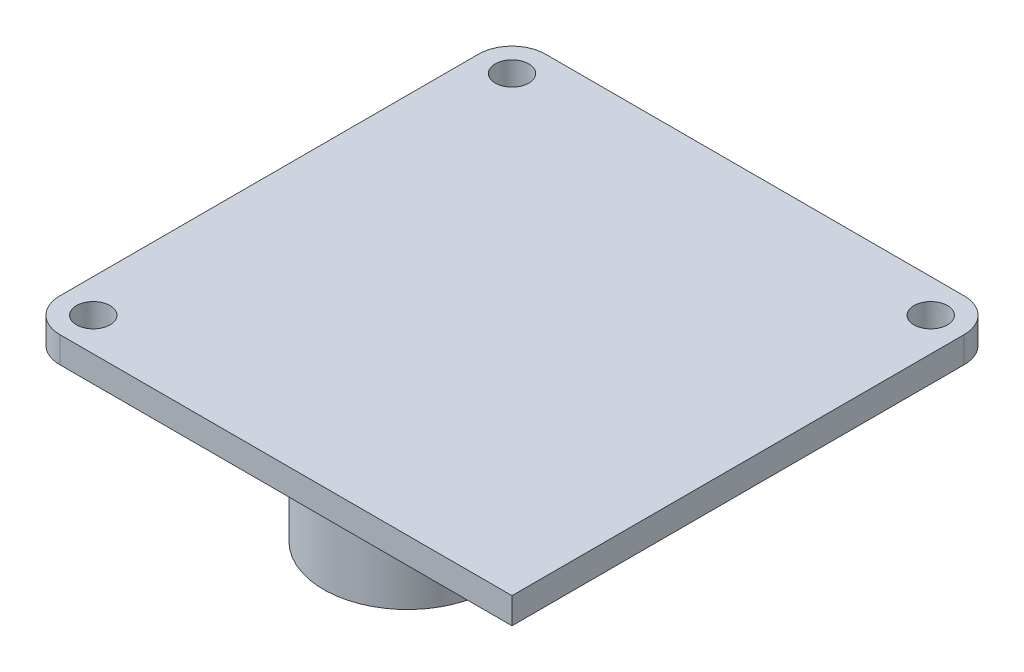
ISO-10303-21;
HEADER;
FILE_DESCRIPTION(('STEP AP214'),'2;1');
FILE_NAME('part.step','',(''),(''),'','','');
FILE_SCHEMA(('AUTOMOTIVE_DESIGN { 1 0 10303 214 1 1 1 1 }'));
ENDSEC;
DATA;
#1=APPLICATION_CONTEXT('core data for automotive mechanical design processes');
#2=APPLICATION_PROTOCOL_DEFINITION('international standard','automotive_design',2000,#1);
#3=PRODUCT_CONTEXT('',#1,'mechanical');
#4=PRODUCT('Part','Part','',(#3));
#5=PRODUCT_RELATED_PRODUCT_CATEGORY('part','',(#4));
#6=PRODUCT_DEFINITION_FORMATION('','',#4);
#7=PRODUCT_DEFINITION_CONTEXT('part definition',#1,'design');
#8=PRODUCT_DEFINITION('design','',#6,#7);
#9=PRODUCT_DEFINITION_SHAPE('','',#8);
#10=(LENGTH_UNIT() NAMED_UNIT(*) SI_UNIT(.MILLI.,.METRE.));
#11=(NAMED_UNIT(*) PLANE_ANGLE_UNIT() SI_UNIT($,.RADIAN.));
#12=(NAMED_UNIT(*) SI_UNIT($,.STERADIAN.) SOLID_ANGLE_UNIT());
#13=UNCERTAINTY_MEASURE_WITH_UNIT(LENGTH_MEASURE(1.E-05),#10,'distance_accuracy_value','');
#14=(GEOMETRIC_REPRESENTATION_CONTEXT(3) GLOBAL_UNCERTAINTY_ASSIGNED_CONTEXT((#13)) GLOBAL_UNIT_ASSIGNED_CONTEXT((#10,
#11,#12)) REPRESENTATION_CONTEXT('',''));
#15=CARTESIAN_POINT('',(0.,0.,0.));
#16=DIRECTION('',(0.,0.,1.));
#17=DIRECTION('',(1.,0.,0.));
#18=AXIS2_PLACEMENT_3D('',#15,#16,#17);
#19=CARTESIAN_POINT('',(0.,0.,0.));
#20=DIRECTION('',(0.,1.,0.));
#21=DIRECTION('',(1.,0.,0.));
#22=AXIS2_PLACEMENT_3D('',#19,#20,#21);
#23=PLANE('',#22);
#24=CARTESIAN_POINT('',(12.5,0.,-12.5));
#25=DIRECTION('',(0.,-1.,0.));
#26=DIRECTION('',(1.,0.,0.));
#27=AXIS2_PLACEMENT_3D('',#24,#25,#26);
#28=CIRCLE('',#27,1.);
#29=CARTESIAN_POINT('',(11.5,0.,-12.5));
#30=VERTEX_POINT('',#29);
#31=EDGE_CURVE('P0_E189',#30,#30,#28,.T.);
#32=ORIENTED_EDGE('',*,*,#31,.F.);
#33=EDGE_LOOP('',(#32));
#34=FACE_BOUND('',#33,.T.);
#35=CARTESIAN_POINT('',(-12.5,0.,12.5));
#36=DIRECTION('',(0.,-1.,0.));
#37=DIRECTION('',(1.,0.,0.));
#38=AXIS2_PLACEMENT_3D('',#35,#36,#37);
#39=CIRCLE('',#38,1.);
#40=CARTESIAN_POINT('',(-13.5,0.,12.5));
#41=VERTEX_POINT('',#40);
#42=EDGE_CURVE('P0_E237',#41,#41,#39,.T.);
#43=ORIENTED_EDGE('',*,*,#42,.F.);
#44=EDGE_LOOP('',(#43));
#45=FACE_BOUND('',#44,.T.);
#46=CARTESIAN_POINT('',(-12.5,0.,-12.5));
#47=DIRECTION('',(0.,-1.,0.));
#48=DIRECTION('',(1.,0.,0.));
#49=AXIS2_PLACEMENT_3D('',#46,#47,#48);
#50=CIRCLE('',#49,1.);
#51=CARTESIAN_POINT('',(-13.5,0.,-12.5));
#52=VERTEX_POINT('',#51);
#53=EDGE_CURVE('P0_E253',#52,#52,#50,.T.);
#54=ORIENTED_EDGE('',*,*,#53,.F.);
#55=EDGE_LOOP('',(#54));
#56=FACE_BOUND('',#55,.T.);
#57=DIRECTION('',(-1.,0.,0.));
#58=VECTOR('',#57,1.);
#59=CARTESIAN_POINT('',(-2.50000000000017,0.,-11.2500000000072));
#60=LINE('',#59,#58);
#61=CARTESIAN_POINT('',(4.99999999999967,0.,-11.2500000000072));
#62=VERTEX_POINT('',#61);
#63=CARTESIAN_POINT('',(-5.00000000000033,0.,-11.2500000000072));
#64=VERTEX_POINT('',#63);
#65=EDGE_CURVE('P0_E154',#62,#64,#60,.T.);
#66=ORIENTED_EDGE('',*,*,#65,.T.);
#67=DIRECTION('',(0.,0.,1.));
#68=VECTOR('',#67,1.);
#69=CARTESIAN_POINT('',(-5.00000000000033,0.,5.62499999999639));
#70=LINE('',#69,#68);
#71=CARTESIAN_POINT('',(-5.00000000000033,0.,11.2499999999928));
#72=VERTEX_POINT('',#71);
#73=EDGE_CURVE('P0_E203',#64,#72,#70,.T.);
#74=ORIENTED_EDGE('',*,*,#73,.T.);
#75=DIRECTION('',(1.,0.,0.));
#76=VECTOR('',#75,1.);
#77=CARTESIAN_POINT('',(2.49999999999984,0.,11.2499999999928));
#78=LINE('',#77,#76);
#79=CARTESIAN_POINT('',(4.99999999999967,0.,11.2499999999928));
#80=VERTEX_POINT('',#79);
#81=EDGE_CURVE('P0_E155',#72,#80,#78,.T.);
#82=ORIENTED_EDGE('',*,*,#81,.T.);
#83=DIRECTION('',(0.,0.,-1.));
#84=VECTOR('',#83,1.);
#85=CARTESIAN_POINT('',(4.99999999999967,0.,-5.62500000000361));
#86=LINE('',#85,#84);
#87=EDGE_CURVE('P0_E149',#80,#62,#86,.T.);
#88=ORIENTED_EDGE('',*,*,#87,.T.);
#89=EDGE_LOOP('',(#66,#74,#82,#88));
#90=FACE_BOUND('',#89,.T.);
#91=DIRECTION('',(0.,0.,1.));
#92=VECTOR('',#91,1.);
#93=CARTESIAN_POINT('',(14.5,0.,-12.5));
#94=LINE('',#93,#92);
#95=CARTESIAN_POINT('',(14.5,0.,-12.5));
#96=VERTEX_POINT('',#95);
#97=CARTESIAN_POINT('',(14.5,0.,14.5));
#98=VERTEX_POINT('',#97);
#99=EDGE_CURVE('P0_E25',#96,#98,#94,.T.);
#100=ORIENTED_EDGE('',*,*,#99,.T.);
#101=DIRECTION('',(-1.,0.,0.));
#102=VECTOR('',#101,1.);
#103=CARTESIAN_POINT('',(14.5,0.,14.5));
#104=LINE('',#103,#102);
#105=CARTESIAN_POINT('',(-12.5,0.,14.5));
#106=VERTEX_POINT('',#105);
#107=EDGE_CURVE('P0_E256',#98,#106,#104,.T.);
#108=ORIENTED_EDGE('',*,*,#107,.T.);
#109=CARTESIAN_POINT('',(-12.5,0.,12.5));
#110=DIRECTION('',(0.,1.,0.));
#111=DIRECTION('',(-1.,0.,0.));
#112=AXIS2_PLACEMENT_3D('',#109,#110,#111);
#113=CIRCLE('',#112,2.);
#114=CARTESIAN_POINT('',(-14.5,0.,12.5));
#115=VERTEX_POINT('',#114);
#116=EDGE_CURVE('P0_E272',#115,#106,#113,.T.);
#117=ORIENTED_EDGE('',*,*,#116,.F.);
#118=DIRECTION('',(0.,0.,-1.));
#119=VECTOR('',#118,1.);
#120=CARTESIAN_POINT('',(-14.5,0.,12.5));
#121=LINE('',#120,#119);
#122=CARTESIAN_POINT('',(-14.5,0.,-12.5));
#123=VERTEX_POINT('',#122);
#124=EDGE_CURVE('P0_E263',#115,#123,#121,.T.);
#125=ORIENTED_EDGE('',*,*,#124,.T.);
#126=CARTESIAN_POINT('',(-12.5,0.,-12.5));
#127=DIRECTION('',(0.,1.,0.));
#128=DIRECTION('',(0.,0.,-1.));
#129=AXIS2_PLACEMENT_3D('',#126,#127,#128);
#130=CIRCLE('',#129,2.);
#131=CARTESIAN_POINT('',(-12.5,0.,-14.5));
#132=VERTEX_POINT('',#131);
#133=EDGE_CURVE('P0_E200',#132,#123,#130,.T.);
#134=ORIENTED_EDGE('',*,*,#133,.F.);
#135=DIRECTION('',(1.,0.,0.));
#136=VECTOR('',#135,1.);
#137=CARTESIAN_POINT('',(-12.5,0.,-14.5));
#138=LINE('',#137,#136);
#139=CARTESIAN_POINT('',(12.5,0.,-14.5));
#140=VERTEX_POINT('',#139);
#141=EDGE_CURVE('P0_E241',#132,#140,#138,.T.);
#142=ORIENTED_EDGE('',*,*,#141,.T.);
#143=CARTESIAN_POINT('',(12.5,0.,-12.5));
#144=DIRECTION('',(0.,1.,0.));
#145=DIRECTION('',(1.,0.,0.));
#146=AXIS2_PLACEMENT_3D('',#143,#144,#145);
#147=CIRCLE('',#146,2.);
#148=EDGE_CURVE('P0_E210',#96,#140,#147,.T.);
#149=ORIENTED_EDGE('',*,*,#148,.F.);
#150=EDGE_LOOP('',(#100,#108,#117,#125,#134,#142,#149));
#151=FACE_BOUND('',#150,.T.);
#152=ADVANCED_FACE('P0_F17',(#34,#45,#56,#90,#151),#23,.F.);
#153=CARTESIAN_POINT('',(0.,1.56,0.));
#154=DIRECTION('',(0.,1.,0.));
#155=DIRECTION('',(1.,0.,0.));
#156=AXIS2_PLACEMENT_3D('',#153,#154,#155);
#157=PLANE('',#156);
#158=CARTESIAN_POINT('',(12.5,1.56,-12.5));
#159=DIRECTION('',(0.,-1.,0.));
#160=DIRECTION('',(1.,0.,0.));
#161=AXIS2_PLACEMENT_3D('',#158,#159,#160);
#162=CIRCLE('',#161,1.);
#163=CARTESIAN_POINT('',(11.5,1.56,-12.5));
#164=VERTEX_POINT('',#163);
#165=EDGE_CURVE('P0_E224',#164,#164,#162,.T.);
#166=ORIENTED_EDGE('',*,*,#165,.T.);
#167=EDGE_LOOP('',(#166));
#168=FACE_BOUND('',#167,.T.);
#169=CARTESIAN_POINT('',(-12.5,1.56,12.5));
#170=DIRECTION('',(0.,-1.,0.));
#171=DIRECTION('',(1.,0.,0.));
#172=AXIS2_PLACEMENT_3D('',#169,#170,#171);
#173=CIRCLE('',#172,1.);
#174=CARTESIAN_POINT('',(-13.5,1.56,12.5));
#175=VERTEX_POINT('',#174);
#176=EDGE_CURVE('P0_E185',#175,#175,#173,.T.);
#177=ORIENTED_EDGE('',*,*,#176,.T.);
#178=EDGE_LOOP('',(#177));
#179=FACE_BOUND('',#178,.T.);
#180=CARTESIAN_POINT('',(-12.5,1.56,-12.5));
#181=DIRECTION('',(0.,-1.,0.));
#182=DIRECTION('',(1.,0.,0.));
#183=AXIS2_PLACEMENT_3D('',#180,#181,#182);
#184=CIRCLE('',#183,1.);
#185=CARTESIAN_POINT('',(-13.5,1.56,-12.5));
#186=VERTEX_POINT('',#185);
#187=EDGE_CURVE('P0_E240',#186,#186,#184,.T.);
#188=ORIENTED_EDGE('',*,*,#187,.T.);
#189=EDGE_LOOP('',(#188));
#190=FACE_BOUND('',#189,.T.);
#191=DIRECTION('',(0.,0.,-1.));
#192=VECTOR('',#191,1.);
#193=CARTESIAN_POINT('',(14.5,1.56,-12.5));
#194=LINE('',#193,#192);
#195=CARTESIAN_POINT('',(14.5,1.56,14.5));
#196=VERTEX_POINT('',#195);
#197=CARTESIAN_POINT('',(14.5,1.56,-12.5));
#198=VERTEX_POINT('',#197);
#199=EDGE_CURVE('P0_E11',#196,#198,#194,.T.);
#200=ORIENTED_EDGE('',*,*,#199,.T.);
#201=CARTESIAN_POINT('',(12.5,1.56,-12.5));
#202=DIRECTION('',(0.,1.,0.));
#203=DIRECTION('',(1.,0.,0.));
#204=AXIS2_PLACEMENT_3D('',#201,#202,#203);
#205=CIRCLE('',#204,2.);
#206=CARTESIAN_POINT('',(12.5,1.56,-14.5));
#207=VERTEX_POINT('',#206);
#208=EDGE_CURVE('P0_E206',#198,#207,#205,.T.);
#209=ORIENTED_EDGE('',*,*,#208,.T.);
#210=DIRECTION('',(-1.,0.,0.));
#211=VECTOR('',#210,1.);
#212=CARTESIAN_POINT('',(-12.5,1.56,-14.5));
#213=LINE('',#212,#211);
#214=CARTESIAN_POINT('',(-12.5,1.56,-14.5));
#215=VERTEX_POINT('',#214);
#216=EDGE_CURVE('P0_E245',#207,#215,#213,.T.);
#217=ORIENTED_EDGE('',*,*,#216,.T.);
#218=CARTESIAN_POINT('',(-12.5,1.56,-12.5));
#219=DIRECTION('',(0.,1.,0.));
#220=DIRECTION('',(0.,0.,-1.));
#221=AXIS2_PLACEMENT_3D('',#218,#219,#220);
#222=CIRCLE('',#221,2.);
#223=CARTESIAN_POINT('',(-14.5,1.56,-12.5));
#224=VERTEX_POINT('',#223);
#225=EDGE_CURVE('P0_E196',#215,#224,#222,.T.);
#226=ORIENTED_EDGE('',*,*,#225,.T.);
#227=DIRECTION('',(0.,0.,1.));
#228=VECTOR('',#227,1.);
#229=CARTESIAN_POINT('',(-14.5,1.56,12.5));
#230=LINE('',#229,#228);
#231=CARTESIAN_POINT('',(-14.5,1.56,12.5));
#232=VERTEX_POINT('',#231);
#233=EDGE_CURVE('P0_E267',#224,#232,#230,.T.);
#234=ORIENTED_EDGE('',*,*,#233,.T.);
#235=CARTESIAN_POINT('',(-12.5,1.56,12.5));
#236=DIRECTION('',(0.,1.,0.));
#237=DIRECTION('',(-1.,0.,0.));
#238=AXIS2_PLACEMENT_3D('',#235,#236,#237);
#239=CIRCLE('',#238,2.);
#240=CARTESIAN_POINT('',(-12.5,1.56,14.5));
#241=VERTEX_POINT('',#240);
#242=EDGE_CURVE('P0_E275',#232,#241,#239,.T.);
#243=ORIENTED_EDGE('',*,*,#242,.T.);
#244=DIRECTION('',(1.,0.,0.));
#245=VECTOR('',#244,1.);
#246=CARTESIAN_POINT('',(14.5,1.56,14.5));
#247=LINE('',#246,#245);
#248=EDGE_CURVE('P0_E181',#241,#196,#247,.T.);
#249=ORIENTED_EDGE('',*,*,#248,.T.);
#250=EDGE_LOOP('',(#200,#209,#217,#226,#234,#243,#249));
#251=FACE_BOUND('',#250,.T.);
#252=ADVANCED_FACE('P0_F331',(#168,#179,#190,#251),#157,.T.);
#253=CARTESIAN_POINT('',(14.5,0.,14.5));
#254=DIRECTION('',(1.,0.,0.));
#255=DIRECTION('',(0.,0.,1.));
#256=AXIS2_PLACEMENT_3D('',#253,#254,#255);
#257=PLANE('',#256);
#258=ORIENTED_EDGE('',*,*,#99,.F.);
#259=DIRECTION('',(0.,1.,0.));
#260=VECTOR('',#259,1.);
#261=CARTESIAN_POINT('',(14.5,0.,-12.5));
#262=LINE('',#261,#260);
#263=EDGE_CURVE('P0_E209',#96,#198,#262,.T.);
#264=ORIENTED_EDGE('',*,*,#263,.T.);
#265=ORIENTED_EDGE('',*,*,#199,.F.);
#266=DIRECTION('',(0.,1.,0.));
#267=VECTOR('',#266,1.);
#268=CARTESIAN_POINT('',(14.5,0.,14.5));
#269=LINE('',#268,#267);
#270=EDGE_CURVE('P0_E184',#98,#196,#269,.T.);
#271=ORIENTED_EDGE('',*,*,#270,.F.);
#272=EDGE_LOOP('',(#258,#264,#265,#271));
#273=FACE_BOUND('',#272,.T.);
#274=ADVANCED_FACE('P0_F306',(#273),#257,.T.);
#275=CARTESIAN_POINT('',(12.5,0.,-12.5));
#276=DIRECTION('',(0.,1.,0.));
#277=DIRECTION('',(1.,0.,0.));
#278=AXIS2_PLACEMENT_3D('',#275,#276,#277);
#279=CYLINDRICAL_SURFACE('',#278,2.);
#280=ORIENTED_EDGE('',*,*,#148,.T.);
#281=DIRECTION('',(0.,1.,0.));
#282=VECTOR('',#281,1.);
#283=CARTESIAN_POINT('',(12.5,0.,-14.5));
#284=LINE('',#283,#282);
#285=EDGE_CURVE('P0_E289',#140,#207,#284,.T.);
#286=ORIENTED_EDGE('',*,*,#285,.T.);
#287=ORIENTED_EDGE('',*,*,#208,.F.);
#288=ORIENTED_EDGE('',*,*,#263,.F.);
#289=EDGE_LOOP('',(#280,#286,#287,#288));
#290=FACE_BOUND('',#289,.T.);
#291=ADVANCED_FACE('P0_F330',(#290),#279,.T.);
#292=CARTESIAN_POINT('',(12.5,0.,-14.5));
#293=DIRECTION('',(0.,0.,-1.));
#294=DIRECTION('',(0.,-1.,0.));
#295=AXIS2_PLACEMENT_3D('',#292,#293,#294);
#296=PLANE('',#295);
#297=ORIENTED_EDGE('',*,*,#141,.F.);
#298=DIRECTION('',(0.,1.,0.));
#299=VECTOR('',#298,1.);
#300=CARTESIAN_POINT('',(-12.5,0.,-14.5));
#301=LINE('',#300,#299);
#302=EDGE_CURVE('P0_E199',#132,#215,#301,.T.);
#303=ORIENTED_EDGE('',*,*,#302,.T.);
#304=ORIENTED_EDGE('',*,*,#216,.F.);
#305=ORIENTED_EDGE('',*,*,#285,.F.);
#306=EDGE_LOOP('',(#297,#303,#304,#305));
#307=FACE_BOUND('',#306,.T.);
#308=ADVANCED_FACE('P0_F326',(#307),#296,.T.);
#309=CARTESIAN_POINT('',(-12.5,0.,-12.5));
#310=DIRECTION('',(0.,1.,0.));
#311=DIRECTION('',(0.,0.,-1.));
#312=AXIS2_PLACEMENT_3D('',#309,#310,#311);
#313=CYLINDRICAL_SURFACE('',#312,2.);
#314=ORIENTED_EDGE('',*,*,#133,.T.);
#315=DIRECTION('',(0.,1.,0.));
#316=VECTOR('',#315,1.);
#317=CARTESIAN_POINT('',(-14.5,0.,-12.5));
#318=LINE('',#317,#316);
#319=EDGE_CURVE('P0_E286',#123,#224,#318,.T.);
#320=ORIENTED_EDGE('',*,*,#319,.T.);
#321=ORIENTED_EDGE('',*,*,#225,.F.);
#322=ORIENTED_EDGE('',*,*,#302,.F.);
#323=EDGE_LOOP('',(#314,#320,#321,#322));
#324=FACE_BOUND('',#323,.T.);
#325=ADVANCED_FACE('P0_F322',(#324),#313,.T.);
#326=CARTESIAN_POINT('',(-14.5,0.,-12.5));
#327=DIRECTION('',(-1.,0.,0.));
#328=DIRECTION('',(0.,0.,1.));
#329=AXIS2_PLACEMENT_3D('',#326,#327,#328);
#330=PLANE('',#329);
#331=ORIENTED_EDGE('',*,*,#124,.F.);
#332=DIRECTION('',(0.,1.,0.));
#333=VECTOR('',#332,1.);
#334=CARTESIAN_POINT('',(-14.5,0.,12.5));
#335=LINE('',#334,#333);
#336=EDGE_CURVE('P0_E268',#115,#232,#335,.T.);
#337=ORIENTED_EDGE('',*,*,#336,.T.);
#338=ORIENTED_EDGE('',*,*,#233,.F.);
#339=ORIENTED_EDGE('',*,*,#319,.F.);
#340=EDGE_LOOP('',(#331,#337,#338,#339));
#341=FACE_BOUND('',#340,.T.);
#342=ADVANCED_FACE('P0_F318',(#341),#330,.T.);
#343=CARTESIAN_POINT('',(-12.5,0.,12.5));
#344=DIRECTION('',(0.,1.,0.));
#345=DIRECTION('',(-1.,0.,0.));
#346=AXIS2_PLACEMENT_3D('',#343,#344,#345);
#347=CYLINDRICAL_SURFACE('',#346,2.);
#348=ORIENTED_EDGE('',*,*,#116,.T.);
#349=DIRECTION('',(0.,1.,0.));
#350=VECTOR('',#349,1.);
#351=CARTESIAN_POINT('',(-12.5,0.,14.5));
#352=LINE('',#351,#350);
#353=EDGE_CURVE('P0_E183',#106,#241,#352,.T.);
#354=ORIENTED_EDGE('',*,*,#353,.T.);
#355=ORIENTED_EDGE('',*,*,#242,.F.);
#356=ORIENTED_EDGE('',*,*,#336,.F.);
#357=EDGE_LOOP('',(#348,#354,#355,#356));
#358=FACE_BOUND('',#357,.T.);
#359=ADVANCED_FACE('P0_F313',(#358),#347,.T.);
#360=CARTESIAN_POINT('',(-12.5,0.,14.5));
#361=DIRECTION('',(0.,0.,1.));
#362=DIRECTION('',(1.,0.,0.));
#363=AXIS2_PLACEMENT_3D('',#360,#361,#362);
#364=PLANE('',#363);
#365=ORIENTED_EDGE('',*,*,#107,.F.);
#366=ORIENTED_EDGE('',*,*,#270,.T.);
#367=ORIENTED_EDGE('',*,*,#248,.F.);
#368=ORIENTED_EDGE('',*,*,#353,.F.);
#369=EDGE_LOOP('',(#365,#366,#367,#368));
#370=FACE_BOUND('',#369,.T.);
#371=ADVANCED_FACE('P0_F310',(#370),#364,.T.);
#372=CARTESIAN_POINT('',(-12.5,0.,-12.5));
#373=DIRECTION('',(0.,1.,0.));
#374=DIRECTION('',(1.,0.,0.));
#375=AXIS2_PLACEMENT_3D('',#372,#373,#374);
#376=CYLINDRICAL_SURFACE('',#375,1.);
#377=ORIENTED_EDGE('',*,*,#187,.F.);
#378=DIRECTION('',(0.,-1.,0.));
#379=VECTOR('',#378,1.);
#380=CARTESIAN_POINT('',(-13.5,0.,-12.5));
#381=LINE('',#380,#379);
#382=EDGE_CURVE('P0_E249',#186,#52,#381,.T.);
#383=ORIENTED_EDGE('',*,*,#382,.T.);
#384=ORIENTED_EDGE('',*,*,#53,.T.);
#385=ORIENTED_EDGE('',*,*,#382,.F.);
#386=EDGE_LOOP('',(#377,#383,#384,#385));
#387=FACE_BOUND('',#386,.T.);
#388=ADVANCED_FACE('P0_F349',(#387),#376,.F.);
#389=CARTESIAN_POINT('',(-12.5,0.,12.5));
#390=DIRECTION('',(0.,1.,0.));
#391=DIRECTION('',(1.,0.,0.));
#392=AXIS2_PLACEMENT_3D('',#389,#390,#391);
#393=CYLINDRICAL_SURFACE('',#392,1.);
#394=ORIENTED_EDGE('',*,*,#176,.F.);
#395=DIRECTION('',(0.,-1.,0.));
#396=VECTOR('',#395,1.);
#397=CARTESIAN_POINT('',(-13.5,0.,12.5));
#398=LINE('',#397,#396);
#399=EDGE_CURVE('P0_E188',#175,#41,#398,.T.);
#400=ORIENTED_EDGE('',*,*,#399,.T.);
#401=ORIENTED_EDGE('',*,*,#42,.T.);
#402=ORIENTED_EDGE('',*,*,#399,.F.);
#403=EDGE_LOOP('',(#394,#400,#401,#402));
#404=FACE_BOUND('',#403,.T.);
#405=ADVANCED_FACE('P0_F346',(#404),#393,.F.);
#406=CARTESIAN_POINT('',(12.5,0.,-12.5));
#407=DIRECTION('',(0.,1.,0.));
#408=DIRECTION('',(1.,0.,0.));
#409=AXIS2_PLACEMENT_3D('',#406,#407,#408);
#410=CYLINDRICAL_SURFACE('',#409,1.);
#411=ORIENTED_EDGE('',*,*,#165,.F.);
#412=DIRECTION('',(0.,-1.,0.));
#413=VECTOR('',#412,1.);
#414=CARTESIAN_POINT('',(11.5,0.,-12.5));
#415=LINE('',#414,#413);
#416=EDGE_CURVE('P0_E228',#164,#30,#415,.T.);
#417=ORIENTED_EDGE('',*,*,#416,.T.);
#418=ORIENTED_EDGE('',*,*,#31,.T.);
#419=ORIENTED_EDGE('',*,*,#416,.F.);
#420=EDGE_LOOP('',(#411,#417,#418,#419));
#421=FACE_BOUND('',#420,.T.);
#422=ADVANCED_FACE('P0_F345',(#421),#410,.F.);
#423=CARTESIAN_POINT('',(-3.31956684362922E-13,-2.,-7.21422921401427E-12));
#424=DIRECTION('',(0.,-1.,0.));
#425=DIRECTION('',(0.,0.,-1.));
#426=AXIS2_PLACEMENT_3D('',#423,#424,#425);
#427=PLANE('',#426);
#428=DIRECTION('',(0.,0.,1.));
#429=VECTOR('',#428,1.);
#430=CARTESIAN_POINT('',(4.99999999999967,-2.,-11.2500000000072));
#431=LINE('',#430,#429);
#432=CARTESIAN_POINT('',(4.99999999999967,-2.,-11.2500000000072));
#433=VERTEX_POINT('',#432);
#434=CARTESIAN_POINT('',(4.99999999999967,-2.,11.2499999999928));
#435=VERTEX_POINT('',#434);
#436=EDGE_CURVE('P0_E160',#433,#435,#431,.T.);
#437=ORIENTED_EDGE('',*,*,#436,.T.);
#438=DIRECTION('',(-1.,0.,0.));
#439=VECTOR('',#438,1.);
#440=CARTESIAN_POINT('',(4.99999999999967,-2.,11.2499999999928));
#441=LINE('',#440,#439);
#442=CARTESIAN_POINT('',(-5.00000000000033,-2.,11.2499999999928));
#443=VERTEX_POINT('',#442);
#444=EDGE_CURVE('P0_E217',#435,#443,#441,.T.);
#445=ORIENTED_EDGE('',*,*,#444,.T.);
#446=DIRECTION('',(0.,0.,-1.));
#447=VECTOR('',#446,1.);
#448=CARTESIAN_POINT('',(-5.00000000000033,-2.,11.2499999999928));
#449=LINE('',#448,#447);
#450=CARTESIAN_POINT('',(-5.00000000000033,-2.,-11.2500000000072));
#451=VERTEX_POINT('',#450);
#452=EDGE_CURVE('P0_E195',#443,#451,#449,.T.);
#453=ORIENTED_EDGE('',*,*,#452,.T.);
#454=DIRECTION('',(1.,0.,0.));
#455=VECTOR('',#454,1.);
#456=CARTESIAN_POINT('',(-5.00000000000033,-2.,-11.2500000000072));
#457=LINE('',#456,#455);
#458=EDGE_CURVE('P0_E170',#451,#433,#457,.T.);
#459=ORIENTED_EDGE('',*,*,#458,.T.);
#460=EDGE_LOOP('',(#437,#445,#453,#459));
#461=FACE_BOUND('',#460,.T.);
#462=ADVANCED_FACE('P0_F413',(#461),#427,.T.);
#463=CARTESIAN_POINT('',(4.99999999999967,0.,-11.2500000000072));
#464=DIRECTION('',(1.,0.,0.));
#465=DIRECTION('',(0.,1.,0.));
#466=AXIS2_PLACEMENT_3D('',#463,#464,#465);
#467=PLANE('',#466);
#468=ORIENTED_EDGE('',*,*,#87,.F.);
#469=DIRECTION('',(0.,-1.,0.));
#470=VECTOR('',#469,1.);
#471=CARTESIAN_POINT('',(4.99999999999967,0.,11.2499999999928));
#472=LINE('',#471,#470);
#473=EDGE_CURVE('P0_E161',#80,#435,#472,.T.);
#474=ORIENTED_EDGE('',*,*,#473,.T.);
#475=ORIENTED_EDGE('',*,*,#436,.F.);
#476=DIRECTION('',(0.,-1.,0.));
#477=VECTOR('',#476,1.);
#478=CARTESIAN_POINT('',(4.99999999999967,0.,-11.2500000000072));
#479=LINE('',#478,#477);
#480=EDGE_CURVE('P0_E164',#62,#433,#479,.T.);
#481=ORIENTED_EDGE('',*,*,#480,.F.);
#482=EDGE_LOOP('',(#468,#474,#475,#481));
#483=FACE_BOUND('',#482,.T.);
#484=ADVANCED_FACE('P0_F165',(#483),#467,.T.);
#485=CARTESIAN_POINT('',(4.99999999999967,0.,11.2499999999928));
#486=DIRECTION('',(0.,0.,1.));
#487=DIRECTION('',(1.,0.,0.));
#488=AXIS2_PLACEMENT_3D('',#485,#486,#487);
#489=PLANE('',#488);
#490=ORIENTED_EDGE('',*,*,#81,.F.);
#491=DIRECTION('',(0.,-1.,0.));
#492=VECTOR('',#491,1.);
#493=CARTESIAN_POINT('',(-5.00000000000033,0.,11.2499999999928));
#494=LINE('',#493,#492);
#495=EDGE_CURVE('P0_E191',#72,#443,#494,.T.);
#496=ORIENTED_EDGE('',*,*,#495,.T.);
#497=ORIENTED_EDGE('',*,*,#444,.F.);
#498=ORIENTED_EDGE('',*,*,#473,.F.);
#499=EDGE_LOOP('',(#490,#496,#497,#498));
#500=FACE_BOUND('',#499,.T.);
#501=ADVANCED_FACE('P0_F429',(#500),#489,.T.);
#502=CARTESIAN_POINT('',(-5.00000000000033,0.,11.2499999999928));
#503=DIRECTION('',(-1.,0.,0.));
#504=DIRECTION('',(0.,1.,0.));
#505=AXIS2_PLACEMENT_3D('',#502,#503,#504);
#506=PLANE('',#505);
#507=ORIENTED_EDGE('',*,*,#73,.F.);
#508=DIRECTION('',(0.,-1.,0.));
#509=VECTOR('',#508,1.);
#510=CARTESIAN_POINT('',(-5.00000000000033,0.,-11.2500000000072));
#511=LINE('',#510,#509);
#512=EDGE_CURVE('P0_E175',#64,#451,#511,.T.);
#513=ORIENTED_EDGE('',*,*,#512,.T.);
#514=ORIENTED_EDGE('',*,*,#452,.F.);
#515=ORIENTED_EDGE('',*,*,#495,.F.);
#516=EDGE_LOOP('',(#507,#513,#514,#515));
#517=FACE_BOUND('',#516,.T.);
#518=ADVANCED_FACE('P0_F437',(#517),#506,.T.);
#519=CARTESIAN_POINT('',(-5.00000000000033,0.,-11.2500000000072));
#520=DIRECTION('',(0.,0.,-1.));
#521=DIRECTION('',(-1.,0.,0.));
#522=AXIS2_PLACEMENT_3D('',#519,#520,#521);
#523=PLANE('',#522);
#524=ORIENTED_EDGE('',*,*,#65,.F.);
#525=ORIENTED_EDGE('',*,*,#480,.T.);
#526=ORIENTED_EDGE('',*,*,#458,.F.);
#527=ORIENTED_EDGE('',*,*,#512,.F.);
#528=EDGE_LOOP('',(#524,#525,#526,#527));
#529=FACE_BOUND('',#528,.T.);
#530=ADVANCED_FACE('P0_F173',(#529),#523,.T.);
#531=CLOSED_SHELL('',(#152,#252,#274,#291,#308,#325,#342,#359,#371,#388,#405,#422,#462,#484,
#501,#518,#530));
#532=MANIFOLD_SOLID_BREP('P0_B1',#531);
#533=CARTESIAN_POINT('',(-3.31401572850609E-13,-2.,6.24999999999279));
#534=DIRECTION('',(0.,-1.,0.));
#535=DIRECTION('',(0.,0.,-1.));
#536=AXIS2_PLACEMENT_3D('',#533,#534,#535);
#537=PLANE('',#536);
#538=DIRECTION('',(-1.,0.,0.));
#539=VECTOR('',#538,1.);
#540=CARTESIAN_POINT('',(4.99999999999967,-2.,1.24999999999279));
#541=LINE('',#540,#539);
#542=CARTESIAN_POINT('',(4.99999999999967,-2.,1.24999999999279));
#543=VERTEX_POINT('',#542);
#544=CARTESIAN_POINT('',(-5.00000000000033,-2.,1.24999999999279));
#545=VERTEX_POINT('',#544);
#546=EDGE_CURVE('P1_E11',#543,#545,#541,.T.);
#547=ORIENTED_EDGE('',*,*,#546,.T.);
#548=DIRECTION('',(0.,0.,1.));
#549=VECTOR('',#548,1.);
#550=CARTESIAN_POINT('',(-5.00000000000033,-2.,1.24999999999279));
#551=LINE('',#550,#549);
#552=CARTESIAN_POINT('',(-5.00000000000033,-2.,11.2499999999928));
#553=VERTEX_POINT('',#552);
#554=EDGE_CURVE('P1_E68',#545,#553,#551,.T.);
#555=ORIENTED_EDGE('',*,*,#554,.T.);
#556=DIRECTION('',(1.,0.,0.));
#557=VECTOR('',#556,1.);
#558=CARTESIAN_POINT('',(-5.00000000000033,-2.,11.2499999999928));
#559=LINE('',#558,#557);
#560=CARTESIAN_POINT('',(4.99999999999967,-2.,11.2499999999928));
#561=VERTEX_POINT('',#560);
#562=EDGE_CURVE('P1_E95',#553,#561,#559,.T.);
#563=ORIENTED_EDGE('',*,*,#562,.T.);
#564=DIRECTION('',(0.,0.,-1.));
#565=VECTOR('',#564,1.);
#566=CARTESIAN_POINT('',(4.99999999999967,-2.,11.2499999999928));
#567=LINE('',#566,#565);
#568=EDGE_CURVE('P1_E48',#561,#543,#567,.T.);
#569=ORIENTED_EDGE('',*,*,#568,.T.);
#570=EDGE_LOOP('',(#547,#555,#563,#569));
#571=FACE_BOUND('',#570,.T.);
#572=ADVANCED_FACE('P1_F17',(#571),#537,.F.);
#573=CARTESIAN_POINT('',(-5.00000000000033,-2.,1.24999999999279));
#574=DIRECTION('',(0.,0.,-1.));
#575=DIRECTION('',(0.,-1.,0.));
#576=AXIS2_PLACEMENT_3D('',#573,#574,#575);
#577=PLANE('',#576);
#578=ORIENTED_EDGE('',*,*,#546,.F.);
#579=DIRECTION('',(0.,-1.,0.));
#580=VECTOR('',#579,1.);
#581=CARTESIAN_POINT('',(4.99999999999967,-2.,1.24999999999279));
#582=LINE('',#581,#580);
#583=CARTESIAN_POINT('',(4.99999999999967,-3.,1.24999999999279));
#584=VERTEX_POINT('',#583);
#585=EDGE_CURVE('P1_E26',#543,#584,#582,.T.);
#586=ORIENTED_EDGE('',*,*,#585,.T.);
#587=DIRECTION('',(1.,0.,0.));
#588=VECTOR('',#587,1.);
#589=CARTESIAN_POINT('',(4.99999999999967,-3.,1.24999999999279));
#590=LINE('',#589,#588);
#591=CARTESIAN_POINT('',(-3.31401572850609E-13,-3.,1.24999999999279));
#592=VERTEX_POINT('',#591);
#593=EDGE_CURVE('P1_E107',#592,#584,#590,.T.);
#594=ORIENTED_EDGE('',*,*,#593,.F.);
#595=DIRECTION('',(1.,0.,0.));
#596=VECTOR('',#595,1.);
#597=CARTESIAN_POINT('',(4.99999999999967,-3.,1.24999999999279));
#598=LINE('',#597,#596);
#599=CARTESIAN_POINT('',(-5.00000000000033,-3.,1.24999999999279));
#600=VERTEX_POINT('',#599);
#601=EDGE_CURVE('P1_E74',#600,#592,#598,.T.);
#602=ORIENTED_EDGE('',*,*,#601,.F.);
#603=DIRECTION('',(0.,-1.,0.));
#604=VECTOR('',#603,1.);
#605=CARTESIAN_POINT('',(-5.00000000000033,-2.,1.24999999999279));
#606=LINE('',#605,#604);
#607=EDGE_CURVE('P1_E70',#545,#600,#606,.T.);
#608=ORIENTED_EDGE('',*,*,#607,.F.);
#609=EDGE_LOOP('',(#578,#586,#594,#602,#608));
#610=FACE_BOUND('',#609,.T.);
#611=ADVANCED_FACE('P1_F71',(#610),#577,.T.);
#612=CARTESIAN_POINT('',(4.99999999999967,-2.,1.24999999999279));
#613=DIRECTION('',(1.,0.,0.));
#614=DIRECTION('',(0.,1.,0.));
#615=AXIS2_PLACEMENT_3D('',#612,#613,#614);
#616=PLANE('',#615);
#617=ORIENTED_EDGE('',*,*,#568,.F.);
#618=DIRECTION('',(0.,-1.,0.));
#619=VECTOR('',#618,1.);
#620=CARTESIAN_POINT('',(4.99999999999967,-2.,11.2499999999928));
#621=LINE('',#620,#619);
#622=CARTESIAN_POINT('',(4.99999999999967,-3.,11.2499999999928));
#623=VERTEX_POINT('',#622);
#624=EDGE_CURVE('P1_E98',#561,#623,#621,.T.);
#625=ORIENTED_EDGE('',*,*,#624,.T.);
#626=DIRECTION('',(0.,0.,1.));
#627=VECTOR('',#626,1.);
#628=CARTESIAN_POINT('',(4.99999999999967,-3.,11.2499999999928));
#629=LINE('',#628,#627);
#630=CARTESIAN_POINT('',(4.99999999999967,-3.,6.24999999999279));
#631=VERTEX_POINT('',#630);
#632=EDGE_CURVE('P1_E114',#631,#623,#629,.T.);
#633=ORIENTED_EDGE('',*,*,#632,.F.);
#634=DIRECTION('',(0.,0.,1.));
#635=VECTOR('',#634,1.);
#636=CARTESIAN_POINT('',(4.99999999999967,-3.,11.2499999999928));
#637=LINE('',#636,#635);
#638=EDGE_CURVE('P1_E111',#584,#631,#637,.T.);
#639=ORIENTED_EDGE('',*,*,#638,.F.);
#640=ORIENTED_EDGE('',*,*,#585,.F.);
#641=EDGE_LOOP('',(#617,#625,#633,#639,#640));
#642=FACE_BOUND('',#641,.T.);
#643=ADVANCED_FACE('P1_F19',(#642),#616,.T.);
#644=CARTESIAN_POINT('',(4.99999999999967,-2.,11.2499999999928));
#645=DIRECTION('',(0.,0.,1.));
#646=DIRECTION('',(1.,0.,0.));
#647=AXIS2_PLACEMENT_3D('',#644,#645,#646);
#648=PLANE('',#647);
#649=ORIENTED_EDGE('',*,*,#562,.F.);
#650=DIRECTION('',(0.,-1.,0.));
#651=VECTOR('',#650,1.);
#652=CARTESIAN_POINT('',(-5.00000000000033,-2.,11.2499999999928));
#653=LINE('',#652,#651);
#654=CARTESIAN_POINT('',(-5.00000000000033,-3.,11.2499999999928));
#655=VERTEX_POINT('',#654);
#656=EDGE_CURVE('P1_E79',#553,#655,#653,.T.);
#657=ORIENTED_EDGE('',*,*,#656,.T.);
#658=DIRECTION('',(-1.,0.,0.));
#659=VECTOR('',#658,1.);
#660=CARTESIAN_POINT('',(-5.00000000000033,-3.,11.2499999999928));
#661=LINE('',#660,#659);
#662=CARTESIAN_POINT('',(-3.31401572850609E-13,-3.,11.2499999999928));
#663=VERTEX_POINT('',#662);
#664=EDGE_CURVE('P1_E164',#663,#655,#661,.T.);
#665=ORIENTED_EDGE('',*,*,#664,.F.);
#666=DIRECTION('',(-1.,0.,0.));
#667=VECTOR('',#666,1.);
#668=CARTESIAN_POINT('',(-5.00000000000033,-3.,11.2499999999928));
#669=LINE('',#668,#667);
#670=EDGE_CURVE('P1_E124',#623,#663,#669,.T.);
#671=ORIENTED_EDGE('',*,*,#670,.F.);
#672=ORIENTED_EDGE('',*,*,#624,.F.);
#673=EDGE_LOOP('',(#649,#657,#665,#671,#672));
#674=FACE_BOUND('',#673,.T.);
#675=ADVANCED_FACE('P1_F241',(#674),#648,.T.);
#676=CARTESIAN_POINT('',(-5.00000000000033,-2.,11.2499999999928));
#677=DIRECTION('',(-1.,0.,0.));
#678=DIRECTION('',(0.,0.,1.));
#679=AXIS2_PLACEMENT_3D('',#676,#677,#678);
#680=PLANE('',#679);
#681=ORIENTED_EDGE('',*,*,#554,.F.);
#682=ORIENTED_EDGE('',*,*,#607,.T.);
#683=DIRECTION('',(0.,0.,-1.));
#684=VECTOR('',#683,1.);
#685=CARTESIAN_POINT('',(-5.00000000000033,-3.,1.24999999999279));
#686=LINE('',#685,#684);
#687=CARTESIAN_POINT('',(-5.00000000000033,-3.,6.24999999999278));
#688=VERTEX_POINT('',#687);
#689=EDGE_CURVE('P1_E89',#688,#600,#686,.T.);
#690=ORIENTED_EDGE('',*,*,#689,.F.);
#691=DIRECTION('',(0.,0.,-1.));
#692=VECTOR('',#691,1.);
#693=CARTESIAN_POINT('',(-5.00000000000033,-3.,1.24999999999279));
#694=LINE('',#693,#692);
#695=EDGE_CURVE('P1_E160',#655,#688,#694,.T.);
#696=ORIENTED_EDGE('',*,*,#695,.F.);
#697=ORIENTED_EDGE('',*,*,#656,.F.);
#698=EDGE_LOOP('',(#681,#682,#690,#696,#697));
#699=FACE_BOUND('',#698,.T.);
#700=ADVANCED_FACE('P1_F82',(#699),#680,.T.);
#701=CARTESIAN_POINT('',(-3.31401572850609E-13,-3.,6.24999999999279));
#702=DIRECTION('',(0.,-1.,0.));
#703=DIRECTION('',(0.,0.,-1.));
#704=AXIS2_PLACEMENT_3D('',#701,#702,#703);
#705=PLANE('',#704);
#706=CARTESIAN_POINT('',(-3.31401572850609E-13,-3.,6.24999999999279));
#707=DIRECTION('',(0.,1.,0.));
#708=DIRECTION('',(1.,0.,0.));
#709=AXIS2_PLACEMENT_3D('',#706,#707,#708);
#710=CIRCLE('',#709,5.);
#711=EDGE_CURVE('P1_E144',#592,#688,#710,.T.);
#712=ORIENTED_EDGE('',*,*,#711,.T.);
#713=ORIENTED_EDGE('',*,*,#689,.T.);
#714=ORIENTED_EDGE('',*,*,#601,.T.);
#715=EDGE_LOOP('',(#712,#713,#714));
#716=FACE_BOUND('',#715,.T.);
#717=ADVANCED_FACE('P1_F176',(#716),#705,.T.);
#718=CARTESIAN_POINT('',(-3.31401572850609E-13,-3.,6.24999999999279));
#719=DIRECTION('',(0.,-1.,0.));
#720=DIRECTION('',(0.,0.,-1.));
#721=AXIS2_PLACEMENT_3D('',#718,#719,#720);
#722=PLANE('',#721);
#723=CARTESIAN_POINT('',(-3.31401572850609E-13,-3.,6.24999999999279));
#724=DIRECTION('',(0.,1.,0.));
#725=DIRECTION('',(1.,0.,0.));
#726=AXIS2_PLACEMENT_3D('',#723,#724,#725);
#727=CIRCLE('',#726,5.);
#728=EDGE_CURVE('P1_E121',#631,#592,#727,.T.);
#729=ORIENTED_EDGE('',*,*,#728,.T.);
#730=ORIENTED_EDGE('',*,*,#593,.T.);
#731=ORIENTED_EDGE('',*,*,#638,.T.);
#732=EDGE_LOOP('',(#729,#730,#731));
#733=FACE_BOUND('',#732,.T.);
#734=ADVANCED_FACE('P1_F119',(#733),#722,.T.);
#735=CARTESIAN_POINT('',(-3.31401572850609E-13,-3.,6.24999999999279));
#736=DIRECTION('',(0.,-1.,0.));
#737=DIRECTION('',(0.,0.,-1.));
#738=AXIS2_PLACEMENT_3D('',#735,#736,#737);
#739=PLANE('',#738);
#740=CARTESIAN_POINT('',(-3.31401572850609E-13,-3.,6.24999999999279));
#741=DIRECTION('',(0.,1.,0.));
#742=DIRECTION('',(1.,0.,0.));
#743=AXIS2_PLACEMENT_3D('',#740,#741,#742);
#744=CIRCLE('',#743,5.);
#745=EDGE_CURVE('P1_E157',#663,#631,#744,.T.);
#746=ORIENTED_EDGE('',*,*,#745,.T.);
#747=ORIENTED_EDGE('',*,*,#632,.T.);
#748=ORIENTED_EDGE('',*,*,#670,.T.);
#749=EDGE_LOOP('',(#746,#747,#748));
#750=FACE_BOUND('',#749,.T.);
#751=ADVANCED_FACE('P1_F194',(#750),#739,.T.);
#752=CARTESIAN_POINT('',(-3.31401572850609E-13,-3.,6.24999999999279));
#753=DIRECTION('',(0.,-1.,0.));
#754=DIRECTION('',(0.,0.,-1.));
#755=AXIS2_PLACEMENT_3D('',#752,#753,#754);
#756=PLANE('',#755);
#757=CARTESIAN_POINT('',(-3.31401572850609E-13,-3.,6.24999999999279));
#758=DIRECTION('',(0.,1.,0.));
#759=DIRECTION('',(1.,0.,0.));
#760=AXIS2_PLACEMENT_3D('',#757,#758,#759);
#761=CIRCLE('',#760,5.);
#762=EDGE_CURVE('P1_E167',#688,#663,#761,.T.);
#763=ORIENTED_EDGE('',*,*,#762,.T.);
#764=ORIENTED_EDGE('',*,*,#664,.T.);
#765=ORIENTED_EDGE('',*,*,#695,.T.);
#766=EDGE_LOOP('',(#763,#764,#765));
#767=FACE_BOUND('',#766,.T.);
#768=ADVANCED_FACE('P1_F184',(#767),#756,.T.);
#769=CARTESIAN_POINT('',(-3.31401572850609E-13,-7.,6.24999999999279));
#770=DIRECTION('',(0.,-1.,0.));
#771=DIRECTION('',(0.,0.,-1.));
#772=AXIS2_PLACEMENT_3D('',#769,#770,#771);
#773=PLANE('',#772);
#774=CARTESIAN_POINT('',(-3.31401572850609E-13,-7.,6.24999999999279));
#775=DIRECTION('',(0.,1.,0.));
#776=DIRECTION('',(1.,0.,0.));
#777=AXIS2_PLACEMENT_3D('',#774,#775,#776);
#778=CIRCLE('',#777,4.17649994832665);
#779=CARTESIAN_POINT('',(-4.17649994832698,-7.,6.24999999999279));
#780=VERTEX_POINT('',#779);
#781=EDGE_CURVE('P1_E132',#780,#780,#778,.T.);
#782=ORIENTED_EDGE('',*,*,#781,.T.);
#783=EDGE_LOOP('',(#782));
#784=FACE_BOUND('',#783,.T.);
#785=CARTESIAN_POINT('',(-3.31401572850609E-13,-7.,6.24999999999279));
#786=DIRECTION('',(0.,-1.,0.));
#787=DIRECTION('',(1.,0.,0.));
#788=AXIS2_PLACEMENT_3D('',#785,#786,#787);
#789=CIRCLE('',#788,5.);
#790=CARTESIAN_POINT('',(-5.00000000000033,-7.,6.24999999999278));
#791=VERTEX_POINT('',#790);
#792=EDGE_CURVE('P1_E143',#791,#791,#789,.T.);
#793=ORIENTED_EDGE('',*,*,#792,.T.);
#794=EDGE_LOOP('',(#793));
#795=FACE_BOUND('',#794,.T.);
#796=ADVANCED_FACE('P1_F218',(#784,#795),#773,.T.);
#797=CARTESIAN_POINT('',(-3.31401572850609E-13,-3.,6.24999999999279));
#798=DIRECTION('',(0.,-1.,0.));
#799=DIRECTION('',(1.,0.,0.));
#800=AXIS2_PLACEMENT_3D('',#797,#798,#799);
#801=CYLINDRICAL_SURFACE('',#800,5.);
#802=ORIENTED_EDGE('',*,*,#792,.F.);
#803=DIRECTION('',(0.,1.,0.));
#804=VECTOR('',#803,1.);
#805=CARTESIAN_POINT('',(-5.00000000000033,-3.,6.24999999999278));
#806=LINE('',#805,#804);
#807=EDGE_CURVE('P1_E148',#791,#688,#806,.T.);
#808=ORIENTED_EDGE('',*,*,#807,.T.);
#809=ORIENTED_EDGE('',*,*,#711,.F.);
#810=ORIENTED_EDGE('',*,*,#728,.F.);
#811=ORIENTED_EDGE('',*,*,#745,.F.);
#812=ORIENTED_EDGE('',*,*,#762,.F.);
#813=ORIENTED_EDGE('',*,*,#807,.F.);
#814=EDGE_LOOP('',(#802,#808,#809,#810,#811,#812,#813));
#815=FACE_BOUND('',#814,.T.);
#816=ADVANCED_FACE('P1_F191',(#815),#801,.T.);
#817=CARTESIAN_POINT('',(-3.31401572850609E-13,-6.5,6.24999999999279));
#818=DIRECTION('',(0.,-1.,0.));
#819=DIRECTION('',(0.,0.,-1.));
#820=AXIS2_PLACEMENT_3D('',#817,#818,#819);
#821=PLANE('',#820);
#822=CARTESIAN_POINT('',(-3.31401572850609E-13,-6.5,6.24999999999279));
#823=DIRECTION('',(0.,1.,0.));
#824=DIRECTION('',(1.,0.,0.));
#825=AXIS2_PLACEMENT_3D('',#822,#823,#824);
#826=CIRCLE('',#825,3.67649994832665);
#827=CARTESIAN_POINT('',(-3.67649994832698,-6.5,6.24999999999279));
#828=VERTEX_POINT('',#827);
#829=EDGE_CURVE('P1_E139',#828,#828,#826,.T.);
#830=ORIENTED_EDGE('',*,*,#829,.F.);
#831=EDGE_LOOP('',(#830));
#832=FACE_BOUND('',#831,.T.);
#833=ADVANCED_FACE('P1_F227',(#832),#821,.T.);
#834=CARTESIAN_POINT('',(-3.31401572850609E-13,-6.75,6.24999999999279));
#835=DIRECTION('',(0.,-1.,0.));
#836=DIRECTION('',(1.,0.,0.));
#837=AXIS2_PLACEMENT_3D('',#834,#835,#836);
#838=CONICAL_SURFACE('',#837,3.92649994832665,0.785398163397448);
#839=ORIENTED_EDGE('',*,*,#781,.F.);
#840=DIRECTION('',(0.707106781186547,0.707106781186548,0.));
#841=VECTOR('',#840,1.);
#842=CARTESIAN_POINT('',(-3.92649994832698,-6.75,6.24999999999279));
#843=LINE('',#842,#841);
#844=EDGE_CURVE('P1_E135',#780,#828,#843,.T.);
#845=ORIENTED_EDGE('',*,*,#844,.T.);
#846=ORIENTED_EDGE('',*,*,#829,.T.);
#847=ORIENTED_EDGE('',*,*,#844,.F.);
#848=EDGE_LOOP('',(#839,#845,#846,#847));
#849=FACE_BOUND('',#848,.T.);
#850=ADVANCED_FACE('P1_F215',(#849),#838,.F.);
#851=CLOSED_SHELL('',(#572,#611,#643,#675,#700,#717,#734,#751,#768,#796,#816,#833,#850));
#852=MANIFOLD_SOLID_BREP('P1_B1',#851);
#853=ADVANCED_BREP_SHAPE_REPRESENTATION('',(#18,#532,#852),#14);
#854=SHAPE_DEFINITION_REPRESENTATION(#9,#853);
ENDSEC;
END-ISO-10303-21;
